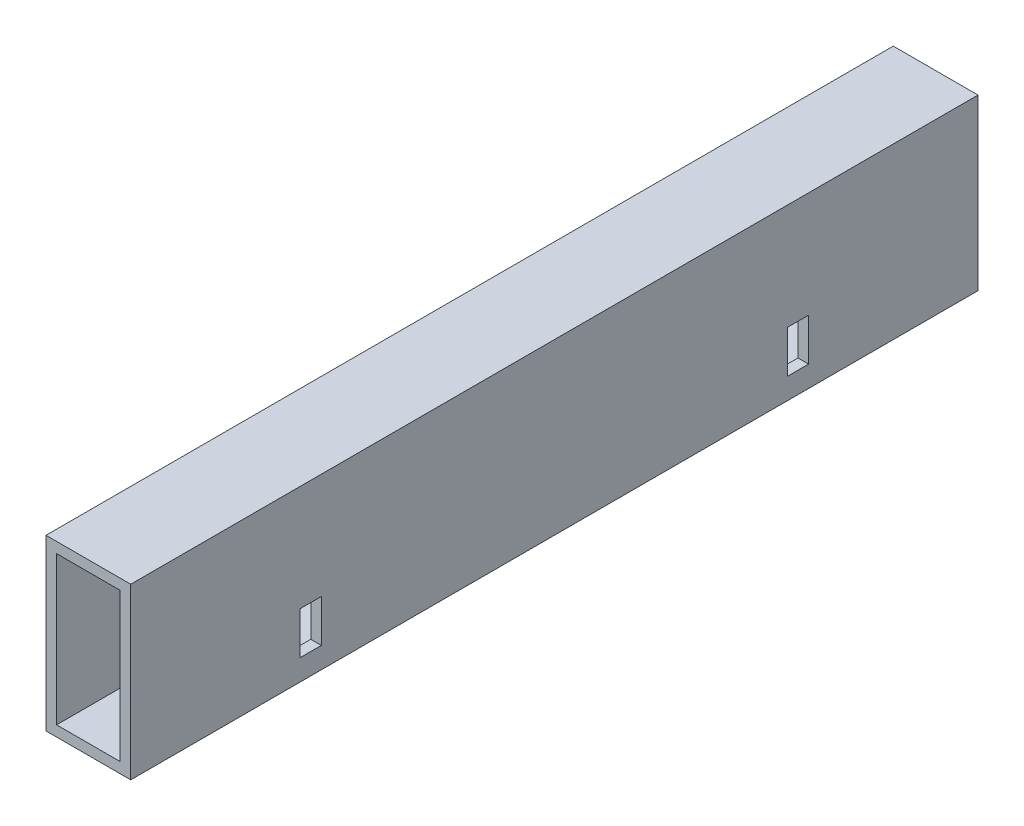
ISO-10303-21;
HEADER;
FILE_DESCRIPTION(('STEP AP214'),'2;1');
FILE_NAME('part.step','',(''),(''),'','','');
FILE_SCHEMA(('AUTOMOTIVE_DESIGN { 1 0 10303 214 1 1 1 1 }'));
ENDSEC;
DATA;
#1=APPLICATION_CONTEXT('core data for automotive mechanical design processes');
#2=APPLICATION_PROTOCOL_DEFINITION('international standard','automotive_design',2000,#1);
#3=PRODUCT_CONTEXT('',#1,'mechanical');
#4=PRODUCT('Part','Part','',(#3));
#5=PRODUCT_RELATED_PRODUCT_CATEGORY('part','',(#4));
#6=PRODUCT_DEFINITION_FORMATION('','',#4);
#7=PRODUCT_DEFINITION_CONTEXT('part definition',#1,'design');
#8=PRODUCT_DEFINITION('design','',#6,#7);
#9=PRODUCT_DEFINITION_SHAPE('','',#8);
#10=(LENGTH_UNIT() NAMED_UNIT(*) SI_UNIT(.MILLI.,.METRE.));
#11=(NAMED_UNIT(*) PLANE_ANGLE_UNIT() SI_UNIT($,.RADIAN.));
#12=(NAMED_UNIT(*) SI_UNIT($,.STERADIAN.) SOLID_ANGLE_UNIT());
#13=UNCERTAINTY_MEASURE_WITH_UNIT(LENGTH_MEASURE(1.E-05),#10,'distance_accuracy_value','');
#14=(GEOMETRIC_REPRESENTATION_CONTEXT(3) GLOBAL_UNCERTAINTY_ASSIGNED_CONTEXT((#13)) GLOBAL_UNIT_ASSIGNED_CONTEXT((#10,
#11,#12)) REPRESENTATION_CONTEXT('',''));
#15=CARTESIAN_POINT('',(0.,0.,0.));
#16=DIRECTION('',(0.,0.,1.));
#17=DIRECTION('',(1.,0.,0.));
#18=AXIS2_PLACEMENT_3D('',#15,#16,#17);
#19=CARTESIAN_POINT('',(0.,0.,254.));
#20=DIRECTION('',(0.,0.,-1.));
#21=DIRECTION('',(-1.,0.,0.));
#22=AXIS2_PLACEMENT_3D('',#19,#20,#21);
#23=PLANE('',#22);
#24=DIRECTION('',(0.,-1.,0.));
#25=VECTOR('',#24,1.);
#26=CARTESIAN_POINT('',(0.,0.,254.));
#27=LINE('',#26,#25);
#28=CARTESIAN_POINT('',(0.,50.8,254.));
#29=VERTEX_POINT('',#28);
#30=CARTESIAN_POINT('',(0.,0.,254.));
#31=VERTEX_POINT('',#30);
#32=EDGE_CURVE('E327',#29,#31,#27,.T.);
#33=ORIENTED_EDGE('',*,*,#32,.T.);
#34=DIRECTION('',(1.,0.,0.));
#35=VECTOR('',#34,1.);
#36=CARTESIAN_POINT('',(0.,0.,254.));
#37=LINE('',#36,#35);
#38=CARTESIAN_POINT('',(25.4,0.,254.));
#39=VERTEX_POINT('',#38);
#40=EDGE_CURVE('E330',#31,#39,#37,.T.);
#41=ORIENTED_EDGE('',*,*,#40,.T.);
#42=DIRECTION('',(0.,1.,0.));
#43=VECTOR('',#42,1.);
#44=CARTESIAN_POINT('',(25.4,0.,254.));
#45=LINE('',#44,#43);
#46=CARTESIAN_POINT('',(25.4,50.8,254.));
#47=VERTEX_POINT('',#46);
#48=EDGE_CURVE('E333',#39,#47,#45,.T.);
#49=ORIENTED_EDGE('',*,*,#48,.T.);
#50=DIRECTION('',(-1.,0.,0.));
#51=VECTOR('',#50,1.);
#52=CARTESIAN_POINT('',(0.,50.8,254.));
#53=LINE('',#52,#51);
#54=EDGE_CURVE('E335',#47,#29,#53,.T.);
#55=ORIENTED_EDGE('',*,*,#54,.T.);
#56=EDGE_LOOP('',(#33,#41,#49,#55));
#57=FACE_BOUND('',#56,.T.);
#58=DIRECTION('',(1.,0.,0.));
#59=VECTOR('',#58,1.);
#60=CARTESIAN_POINT('',(3.175,3.175,254.));
#61=LINE('',#60,#59);
#62=CARTESIAN_POINT('',(3.175,3.175,254.));
#63=VERTEX_POINT('',#62);
#64=CARTESIAN_POINT('',(22.225,3.175,254.));
#65=VERTEX_POINT('',#64);
#66=EDGE_CURVE('E296',#63,#65,#61,.T.);
#67=ORIENTED_EDGE('',*,*,#66,.F.);
#68=DIRECTION('',(0.,-1.,0.));
#69=VECTOR('',#68,1.);
#70=CARTESIAN_POINT('',(3.175,3.175,254.));
#71=LINE('',#70,#69);
#72=CARTESIAN_POINT('',(3.175,47.625,254.));
#73=VERTEX_POINT('',#72);
#74=EDGE_CURVE('E304',#73,#63,#71,.T.);
#75=ORIENTED_EDGE('',*,*,#74,.F.);
#76=DIRECTION('',(-1.,0.,0.));
#77=VECTOR('',#76,1.);
#78=CARTESIAN_POINT('',(3.175,47.625,254.));
#79=LINE('',#78,#77);
#80=CARTESIAN_POINT('',(22.225,47.625,254.));
#81=VERTEX_POINT('',#80);
#82=EDGE_CURVE('E301',#81,#73,#79,.T.);
#83=ORIENTED_EDGE('',*,*,#82,.F.);
#84=DIRECTION('',(0.,1.,0.));
#85=VECTOR('',#84,1.);
#86=CARTESIAN_POINT('',(22.225,3.175,254.));
#87=LINE('',#86,#85);
#88=EDGE_CURVE('E298',#65,#81,#87,.T.);
#89=ORIENTED_EDGE('',*,*,#88,.F.);
#90=EDGE_LOOP('',(#67,#75,#83,#89));
#91=FACE_BOUND('',#90,.T.);
#92=ADVANCED_FACE('F35',(#57,#91),#23,.F.);
#93=CARTESIAN_POINT('',(0.,0.,0.));
#94=DIRECTION('',(0.,0.,-1.));
#95=DIRECTION('',(-1.,0.,0.));
#96=AXIS2_PLACEMENT_3D('',#93,#94,#95);
#97=PLANE('',#96);
#98=DIRECTION('',(0.,-1.,0.));
#99=VECTOR('',#98,1.);
#100=CARTESIAN_POINT('',(0.,0.,0.));
#101=LINE('',#100,#99);
#102=CARTESIAN_POINT('',(0.,50.8,0.));
#103=VERTEX_POINT('',#102);
#104=CARTESIAN_POINT('',(0.,0.,0.));
#105=VERTEX_POINT('',#104);
#106=EDGE_CURVE('E326',#103,#105,#101,.T.);
#107=ORIENTED_EDGE('',*,*,#106,.F.);
#108=DIRECTION('',(-1.,0.,0.));
#109=VECTOR('',#108,1.);
#110=CARTESIAN_POINT('',(0.,50.8,0.));
#111=LINE('',#110,#109);
#112=CARTESIAN_POINT('',(25.4,50.8,0.));
#113=VERTEX_POINT('',#112);
#114=EDGE_CURVE('E331',#113,#103,#111,.T.);
#115=ORIENTED_EDGE('',*,*,#114,.F.);
#116=DIRECTION('',(0.,1.,0.));
#117=VECTOR('',#116,1.);
#118=CARTESIAN_POINT('',(25.4,0.,0.));
#119=LINE('',#118,#117);
#120=CARTESIAN_POINT('',(25.4,0.,0.));
#121=VERTEX_POINT('',#120);
#122=EDGE_CURVE('E342',#121,#113,#119,.T.);
#123=ORIENTED_EDGE('',*,*,#122,.F.);
#124=DIRECTION('',(1.,0.,0.));
#125=VECTOR('',#124,1.);
#126=CARTESIAN_POINT('',(0.,0.,0.));
#127=LINE('',#126,#125);
#128=EDGE_CURVE('E340',#105,#121,#127,.T.);
#129=ORIENTED_EDGE('',*,*,#128,.F.);
#130=EDGE_LOOP('',(#107,#115,#123,#129));
#131=FACE_BOUND('',#130,.T.);
#132=DIRECTION('',(0.,-1.,0.));
#133=VECTOR('',#132,1.);
#134=CARTESIAN_POINT('',(3.175,3.175,0.));
#135=LINE('',#134,#133);
#136=CARTESIAN_POINT('',(3.175,47.625,0.));
#137=VERTEX_POINT('',#136);
#138=CARTESIAN_POINT('',(3.175,3.175,0.));
#139=VERTEX_POINT('',#138);
#140=EDGE_CURVE('E299',#137,#139,#135,.T.);
#141=ORIENTED_EDGE('',*,*,#140,.T.);
#142=DIRECTION('',(1.,0.,0.));
#143=VECTOR('',#142,1.);
#144=CARTESIAN_POINT('',(3.175,3.175,0.));
#145=LINE('',#144,#143);
#146=CARTESIAN_POINT('',(22.225,3.175,0.));
#147=VERTEX_POINT('',#146);
#148=EDGE_CURVE('E295',#139,#147,#145,.T.);
#149=ORIENTED_EDGE('',*,*,#148,.T.);
#150=DIRECTION('',(0.,1.,0.));
#151=VECTOR('',#150,1.);
#152=CARTESIAN_POINT('',(22.225,3.175,0.));
#153=LINE('',#152,#151);
#154=CARTESIAN_POINT('',(22.225,47.625,0.));
#155=VERTEX_POINT('',#154);
#156=EDGE_CURVE('E309',#147,#155,#153,.T.);
#157=ORIENTED_EDGE('',*,*,#156,.T.);
#158=DIRECTION('',(-1.,0.,0.));
#159=VECTOR('',#158,1.);
#160=CARTESIAN_POINT('',(3.175,47.625,0.));
#161=LINE('',#160,#159);
#162=EDGE_CURVE('E312',#155,#137,#161,.T.);
#163=ORIENTED_EDGE('',*,*,#162,.T.);
#164=EDGE_LOOP('',(#141,#149,#157,#163));
#165=FACE_BOUND('',#164,.T.);
#166=ADVANCED_FACE('F389',(#131,#165),#97,.T.);
#167=CARTESIAN_POINT('',(0.,0.,254.));
#168=DIRECTION('',(1.,0.,0.));
#169=DIRECTION('',(0.,0.,-1.));
#170=AXIS2_PLACEMENT_3D('',#167,#168,#169);
#171=PLANE('',#170);
#172=DIRECTION('',(0.,0.,-1.));
#173=VECTOR('',#172,1.);
#174=CARTESIAN_POINT('',(0.,19.0500000000001,50.8000000000017));
#175=LINE('',#174,#173);
#176=CARTESIAN_POINT('',(0.,19.0500000000001,57.1500000000006));
#177=VERTEX_POINT('',#176);
#178=CARTESIAN_POINT('',(0.,19.0500000000001,50.8000000000017));
#179=VERTEX_POINT('',#178);
#180=EDGE_CURVE('E210',#177,#179,#175,.T.);
#181=ORIENTED_EDGE('',*,*,#180,.F.);
#182=DIRECTION('',(0.,1.,0.));
#183=VECTOR('',#182,1.);
#184=CARTESIAN_POINT('',(0.,19.0500000000001,57.1500000000006));
#185=LINE('',#184,#183);
#186=CARTESIAN_POINT('',(0.,6.32674840612091,57.1500000000006));
#187=VERTEX_POINT('',#186);
#188=EDGE_CURVE('E50',#187,#177,#185,.T.);
#189=ORIENTED_EDGE('',*,*,#188,.F.);
#190=DIRECTION('',(0.,-0.00366164378018717,0.999993296159943));
#191=VECTOR('',#190,1.);
#192=CARTESIAN_POINT('',(0.,6.32674840612091,57.1500000000006));
#193=LINE('',#192,#191);
#194=CARTESIAN_POINT('',(0.,6.35000000000006,50.8000000000017));
#195=VERTEX_POINT('',#194);
#196=EDGE_CURVE('E217',#195,#187,#193,.T.);
#197=ORIENTED_EDGE('',*,*,#196,.F.);
#198=DIRECTION('',(0.,-1.,0.));
#199=VECTOR('',#198,1.);
#200=CARTESIAN_POINT('',(0.,6.35000000000006,50.8000000000017));
#201=LINE('',#200,#199);
#202=EDGE_CURVE('E201',#179,#195,#201,.T.);
#203=ORIENTED_EDGE('',*,*,#202,.F.);
#204=EDGE_LOOP('',(#181,#189,#197,#203));
#205=FACE_BOUND('',#204,.T.);
#206=DIRECTION('',(0.,-1.,0.));
#207=VECTOR('',#206,1.);
#208=CARTESIAN_POINT('',(0.,19.0500000000001,196.849999999999));
#209=LINE('',#208,#207);
#210=CARTESIAN_POINT('',(0.,19.0500000000001,196.849999999999));
#211=VERTEX_POINT('',#210);
#212=CARTESIAN_POINT('',(0.,6.32674840612091,196.849999999999));
#213=VERTEX_POINT('',#212);
#214=EDGE_CURVE('E252',#211,#213,#209,.T.);
#215=ORIENTED_EDGE('',*,*,#214,.F.);
#216=DIRECTION('',(0.,0.,-1.));
#217=VECTOR('',#216,1.);
#218=CARTESIAN_POINT('',(0.,19.0500000000001,203.199999999998));
#219=LINE('',#218,#217);
#220=CARTESIAN_POINT('',(0.,19.0500000000001,203.199999999998));
#221=VERTEX_POINT('',#220);
#222=EDGE_CURVE('E250',#221,#211,#219,.T.);
#223=ORIENTED_EDGE('',*,*,#222,.F.);
#224=DIRECTION('',(0.,1.,0.));
#225=VECTOR('',#224,1.);
#226=CARTESIAN_POINT('',(0.,6.35000000000008,203.199999999998));
#227=LINE('',#226,#225);
#228=CARTESIAN_POINT('',(0.,6.35000000000008,203.199999999998));
#229=VERTEX_POINT('',#228);
#230=EDGE_CURVE('E258',#229,#221,#227,.T.);
#231=ORIENTED_EDGE('',*,*,#230,.F.);
#232=DIRECTION('',(0.,0.00366164378019018,0.999993296159943));
#233=VECTOR('',#232,1.);
#234=CARTESIAN_POINT('',(0.,6.32674840612091,196.849999999999));
#235=LINE('',#234,#233);
#236=EDGE_CURVE('E255',#213,#229,#235,.T.);
#237=ORIENTED_EDGE('',*,*,#236,.F.);
#238=EDGE_LOOP('',(#215,#223,#231,#237));
#239=FACE_BOUND('',#238,.T.);
#240=ORIENTED_EDGE('',*,*,#106,.T.);
#241=DIRECTION('',(0.,0.,-1.));
#242=VECTOR('',#241,1.);
#243=CARTESIAN_POINT('',(0.,0.,254.));
#244=LINE('',#243,#242);
#245=EDGE_CURVE('E353',#31,#105,#244,.T.);
#246=ORIENTED_EDGE('',*,*,#245,.F.);
#247=ORIENTED_EDGE('',*,*,#32,.F.);
#248=DIRECTION('',(0.,0.,-1.));
#249=VECTOR('',#248,1.);
#250=CARTESIAN_POINT('',(0.,50.8,254.));
#251=LINE('',#250,#249);
#252=EDGE_CURVE('E337',#29,#103,#251,.T.);
#253=ORIENTED_EDGE('',*,*,#252,.T.);
#254=EDGE_LOOP('',(#240,#246,#247,#253));
#255=FACE_BOUND('',#254,.T.);
#256=ADVANCED_FACE('F37',(#205,#239,#255),#171,.F.);
#257=CARTESIAN_POINT('',(0.,0.,254.));
#258=DIRECTION('',(0.,1.,0.));
#259=DIRECTION('',(0.,0.,1.));
#260=AXIS2_PLACEMENT_3D('',#257,#258,#259);
#261=PLANE('',#260);
#262=ORIENTED_EDGE('',*,*,#128,.T.);
#263=DIRECTION('',(0.,0.,-1.));
#264=VECTOR('',#263,1.);
#265=CARTESIAN_POINT('',(25.4,0.,254.));
#266=LINE('',#265,#264);
#267=EDGE_CURVE('E350',#39,#121,#266,.T.);
#268=ORIENTED_EDGE('',*,*,#267,.F.);
#269=ORIENTED_EDGE('',*,*,#40,.F.);
#270=ORIENTED_EDGE('',*,*,#245,.T.);
#271=EDGE_LOOP('',(#262,#268,#269,#270));
#272=FACE_BOUND('',#271,.T.);
#273=ADVANCED_FACE('F408',(#272),#261,.F.);
#274=CARTESIAN_POINT('',(25.4,0.,254.));
#275=DIRECTION('',(-1.,0.,0.));
#276=DIRECTION('',(0.,0.,1.));
#277=AXIS2_PLACEMENT_3D('',#274,#275,#276);
#278=PLANE('',#277);
#279=DIRECTION('',(0.,-0.00366164378018717,0.999993296159943));
#280=VECTOR('',#279,1.);
#281=CARTESIAN_POINT('',(25.4,5.60587383334817,254.020526850663));
#282=LINE('',#281,#280);
#283=CARTESIAN_POINT('',(25.4,6.35000000000006,50.8000000000017));
#284=VERTEX_POINT('',#283);
#285=CARTESIAN_POINT('',(25.4,6.32674840612091,57.1500000000006));
#286=VERTEX_POINT('',#285);
#287=EDGE_CURVE('E241',#284,#286,#282,.T.);
#288=ORIENTED_EDGE('',*,*,#287,.T.);
#289=DIRECTION('',(0.,1.,0.));
#290=VECTOR('',#289,1.);
#291=CARTESIAN_POINT('',(25.4,0.,57.1500000000006));
#292=LINE('',#291,#290);
#293=CARTESIAN_POINT('',(25.4,19.0500000000001,57.1500000000006));
#294=VERTEX_POINT('',#293);
#295=EDGE_CURVE('E247',#286,#294,#292,.T.);
#296=ORIENTED_EDGE('',*,*,#295,.T.);
#297=DIRECTION('',(0.,0.,-1.));
#298=VECTOR('',#297,1.);
#299=CARTESIAN_POINT('',(25.4,19.0500000000001,254.));
#300=LINE('',#299,#298);
#301=CARTESIAN_POINT('',(25.4,19.0500000000001,50.8000000000017));
#302=VERTEX_POINT('',#301);
#303=EDGE_CURVE('E231',#294,#302,#300,.T.);
#304=ORIENTED_EDGE('',*,*,#303,.T.);
#305=DIRECTION('',(0.,-1.,0.));
#306=VECTOR('',#305,1.);
#307=CARTESIAN_POINT('',(25.4,0.,50.8000000000017));
#308=LINE('',#307,#306);
#309=EDGE_CURVE('E236',#302,#284,#308,.T.);
#310=ORIENTED_EDGE('',*,*,#309,.T.);
#311=EDGE_LOOP('',(#288,#296,#304,#310));
#312=FACE_BOUND('',#311,.T.);
#313=DIRECTION('',(0.,1.,0.));
#314=VECTOR('',#313,1.);
#315=CARTESIAN_POINT('',(25.4,0.,203.199999999998));
#316=LINE('',#315,#314);
#317=CARTESIAN_POINT('',(25.4,6.35000000000008,203.199999999998));
#318=VERTEX_POINT('',#317);
#319=CARTESIAN_POINT('',(25.4,19.0500000000001,203.199999999998));
#320=VERTEX_POINT('',#319);
#321=EDGE_CURVE('E286',#318,#320,#316,.T.);
#322=ORIENTED_EDGE('',*,*,#321,.T.);
#323=DIRECTION('',(0.,0.,-1.));
#324=VECTOR('',#323,1.);
#325=CARTESIAN_POINT('',(25.4,19.0500000000002,254.));
#326=LINE('',#325,#324);
#327=CARTESIAN_POINT('',(25.4,19.0500000000001,196.849999999999));
#328=VERTEX_POINT('',#327);
#329=EDGE_CURVE('E292',#320,#328,#326,.T.);
#330=ORIENTED_EDGE('',*,*,#329,.T.);
#331=DIRECTION('',(0.,-1.,0.));
#332=VECTOR('',#331,1.);
#333=CARTESIAN_POINT('',(25.4,0.,196.849999999999));
#334=LINE('',#333,#332);
#335=CARTESIAN_POINT('',(25.4,6.32674840612091,196.849999999999));
#336=VERTEX_POINT('',#335);
#337=EDGE_CURVE('E276',#328,#336,#334,.T.);
#338=ORIENTED_EDGE('',*,*,#337,.T.);
#339=DIRECTION('',(0.,0.00366164378019018,0.999993296159943));
#340=VECTOR('',#339,1.);
#341=CARTESIAN_POINT('',(25.4,6.53592511855902,253.976067610003));
#342=LINE('',#341,#340);
#343=EDGE_CURVE('E281',#336,#318,#342,.T.);
#344=ORIENTED_EDGE('',*,*,#343,.T.);
#345=EDGE_LOOP('',(#322,#330,#338,#344));
#346=FACE_BOUND('',#345,.T.);
#347=ORIENTED_EDGE('',*,*,#122,.T.);
#348=DIRECTION('',(0.,0.,-1.));
#349=VECTOR('',#348,1.);
#350=CARTESIAN_POINT('',(25.4,50.8,254.));
#351=LINE('',#350,#349);
#352=EDGE_CURVE('E347',#47,#113,#351,.T.);
#353=ORIENTED_EDGE('',*,*,#352,.F.);
#354=ORIENTED_EDGE('',*,*,#48,.F.);
#355=ORIENTED_EDGE('',*,*,#267,.T.);
#356=EDGE_LOOP('',(#347,#353,#354,#355));
#357=FACE_BOUND('',#356,.T.);
#358=ADVANCED_FACE('F405',(#312,#346,#357),#278,.F.);
#359=CARTESIAN_POINT('',(0.,50.8,254.));
#360=DIRECTION('',(0.,-1.,0.));
#361=DIRECTION('',(0.,0.,-1.));
#362=AXIS2_PLACEMENT_3D('',#359,#360,#361);
#363=PLANE('',#362);
#364=ORIENTED_EDGE('',*,*,#114,.T.);
#365=ORIENTED_EDGE('',*,*,#252,.F.);
#366=ORIENTED_EDGE('',*,*,#54,.F.);
#367=ORIENTED_EDGE('',*,*,#352,.T.);
#368=EDGE_LOOP('',(#364,#365,#366,#367));
#369=FACE_BOUND('',#368,.T.);
#370=ADVANCED_FACE('F402',(#369),#363,.F.);
#371=CARTESIAN_POINT('',(3.175,3.175,254.));
#372=DIRECTION('',(0.,1.,0.));
#373=DIRECTION('',(0.,0.,1.));
#374=AXIS2_PLACEMENT_3D('',#371,#372,#373);
#375=PLANE('',#374);
#376=ORIENTED_EDGE('',*,*,#148,.F.);
#377=DIRECTION('',(0.,0.,-1.));
#378=VECTOR('',#377,1.);
#379=CARTESIAN_POINT('',(3.175,3.175,254.));
#380=LINE('',#379,#378);
#381=EDGE_CURVE('E306',#63,#139,#380,.T.);
#382=ORIENTED_EDGE('',*,*,#381,.F.);
#383=ORIENTED_EDGE('',*,*,#66,.T.);
#384=DIRECTION('',(0.,0.,-1.));
#385=VECTOR('',#384,1.);
#386=CARTESIAN_POINT('',(22.225,3.175,254.));
#387=LINE('',#386,#385);
#388=EDGE_CURVE('E323',#65,#147,#387,.T.);
#389=ORIENTED_EDGE('',*,*,#388,.T.);
#390=EDGE_LOOP('',(#376,#382,#383,#389));
#391=FACE_BOUND('',#390,.T.);
#392=ADVANCED_FACE('F399',(#391),#375,.T.);
#393=CARTESIAN_POINT('',(22.225,3.175,254.));
#394=DIRECTION('',(-1.,0.,0.));
#395=DIRECTION('',(0.,0.,1.));
#396=AXIS2_PLACEMENT_3D('',#393,#394,#395);
#397=PLANE('',#396);
#398=DIRECTION('',(0.,1.,0.));
#399=VECTOR('',#398,1.);
#400=CARTESIAN_POINT('',(22.225,3.175,57.1500000000006));
#401=LINE('',#400,#399);
#402=CARTESIAN_POINT('',(22.225,6.32674840612091,57.1500000000006));
#403=VERTEX_POINT('',#402);
#404=CARTESIAN_POINT('',(22.225,19.0500000000001,57.1500000000006));
#405=VERTEX_POINT('',#404);
#406=EDGE_CURVE('E244',#403,#405,#401,.T.);
#407=ORIENTED_EDGE('',*,*,#406,.F.);
#408=DIRECTION('',(0.,-0.00366164378018717,0.999993296159943));
#409=VECTOR('',#408,1.);
#410=CARTESIAN_POINT('',(22.225,5.60591640258985,254.008901209598));
#411=LINE('',#410,#409);
#412=CARTESIAN_POINT('',(22.225,6.35000000000006,50.8000000000017));
#413=VERTEX_POINT('',#412);
#414=EDGE_CURVE('E239',#413,#403,#411,.T.);
#415=ORIENTED_EDGE('',*,*,#414,.F.);
#416=DIRECTION('',(0.,-1.,0.));
#417=VECTOR('',#416,1.);
#418=CARTESIAN_POINT('',(22.225,3.175,50.8000000000017));
#419=LINE('',#418,#417);
#420=CARTESIAN_POINT('',(22.225,19.0500000000001,50.8000000000017));
#421=VERTEX_POINT('',#420);
#422=EDGE_CURVE('E234',#421,#413,#419,.T.);
#423=ORIENTED_EDGE('',*,*,#422,.F.);
#424=DIRECTION('',(0.,0.,-1.));
#425=VECTOR('',#424,1.);
#426=CARTESIAN_POINT('',(22.225,19.0500000000001,254.));
#427=LINE('',#426,#425);
#428=EDGE_CURVE('E229',#405,#421,#427,.T.);
#429=ORIENTED_EDGE('',*,*,#428,.F.);
#430=EDGE_LOOP('',(#407,#415,#423,#429));
#431=FACE_BOUND('',#430,.T.);
#432=DIRECTION('',(0.,0.,-1.));
#433=VECTOR('',#432,1.);
#434=CARTESIAN_POINT('',(22.225,19.0500000000002,254.));
#435=LINE('',#434,#433);
#436=CARTESIAN_POINT('',(22.225,19.0500000000001,203.199999999998));
#437=VERTEX_POINT('',#436);
#438=CARTESIAN_POINT('',(22.225,19.0500000000001,196.849999999999));
#439=VERTEX_POINT('',#438);
#440=EDGE_CURVE('E289',#437,#439,#435,.T.);
#441=ORIENTED_EDGE('',*,*,#440,.F.);
#442=DIRECTION('',(0.,1.,0.));
#443=VECTOR('',#442,1.);
#444=CARTESIAN_POINT('',(22.225,3.175,203.199999999998));
#445=LINE('',#444,#443);
#446=CARTESIAN_POINT('',(22.225,6.35000000000008,203.199999999998));
#447=VERTEX_POINT('',#446);
#448=EDGE_CURVE('E284',#447,#437,#445,.T.);
#449=ORIENTED_EDGE('',*,*,#448,.F.);
#450=DIRECTION('',(0.,0.00366164378019018,0.999993296159943));
#451=VECTOR('',#450,1.);
#452=CARTESIAN_POINT('',(22.225,6.5359676878007,253.987693251068));
#453=LINE('',#452,#451);
#454=CARTESIAN_POINT('',(22.225,6.32674840612091,196.849999999999));
#455=VERTEX_POINT('',#454);
#456=EDGE_CURVE('E279',#455,#447,#453,.T.);
#457=ORIENTED_EDGE('',*,*,#456,.F.);
#458=DIRECTION('',(0.,-1.,0.));
#459=VECTOR('',#458,1.);
#460=CARTESIAN_POINT('',(22.225,3.175,196.849999999999));
#461=LINE('',#460,#459);
#462=EDGE_CURVE('E274',#439,#455,#461,.T.);
#463=ORIENTED_EDGE('',*,*,#462,.F.);
#464=EDGE_LOOP('',(#441,#449,#457,#463));
#465=FACE_BOUND('',#464,.T.);
#466=ORIENTED_EDGE('',*,*,#156,.F.);
#467=ORIENTED_EDGE('',*,*,#388,.F.);
#468=ORIENTED_EDGE('',*,*,#88,.T.);
#469=DIRECTION('',(0.,0.,-1.));
#470=VECTOR('',#469,1.);
#471=CARTESIAN_POINT('',(22.225,47.625,254.));
#472=LINE('',#471,#470);
#473=EDGE_CURVE('E321',#81,#155,#472,.T.);
#474=ORIENTED_EDGE('',*,*,#473,.T.);
#475=EDGE_LOOP('',(#466,#467,#468,#474));
#476=FACE_BOUND('',#475,.T.);
#477=ADVANCED_FACE('F440',(#431,#465,#476),#397,.T.);
#478=CARTESIAN_POINT('',(3.175,47.625,254.));
#479=DIRECTION('',(0.,-1.,0.));
#480=DIRECTION('',(0.,0.,-1.));
#481=AXIS2_PLACEMENT_3D('',#478,#479,#480);
#482=PLANE('',#481);
#483=ORIENTED_EDGE('',*,*,#162,.F.);
#484=ORIENTED_EDGE('',*,*,#473,.F.);
#485=ORIENTED_EDGE('',*,*,#82,.T.);
#486=DIRECTION('',(0.,0.,-1.));
#487=VECTOR('',#486,1.);
#488=CARTESIAN_POINT('',(3.175,47.625,254.));
#489=LINE('',#488,#487);
#490=EDGE_CURVE('E319',#73,#137,#489,.T.);
#491=ORIENTED_EDGE('',*,*,#490,.T.);
#492=EDGE_LOOP('',(#483,#484,#485,#491));
#493=FACE_BOUND('',#492,.T.);
#494=ADVANCED_FACE('F442',(#493),#482,.T.);
#495=CARTESIAN_POINT('',(3.175,3.175,254.));
#496=DIRECTION('',(1.,0.,0.));
#497=DIRECTION('',(0.,0.,-1.));
#498=AXIS2_PLACEMENT_3D('',#495,#496,#497);
#499=PLANE('',#498);
#500=DIRECTION('',(0.,-1.,0.));
#501=VECTOR('',#500,1.);
#502=CARTESIAN_POINT('',(3.175,3.175,57.1500000000006));
#503=LINE('',#502,#501);
#504=CARTESIAN_POINT('',(3.17499999999998,19.0500000000001,57.1500000000006));
#505=VERTEX_POINT('',#504);
#506=CARTESIAN_POINT('',(3.17499999999998,6.32674840612091,57.1500000000006));
#507=VERTEX_POINT('',#506);
#508=EDGE_CURVE('E11',#505,#507,#503,.T.);
#509=ORIENTED_EDGE('',*,*,#508,.F.);
#510=DIRECTION('',(0.,0.,1.));
#511=VECTOR('',#510,1.);
#512=CARTESIAN_POINT('',(3.175,19.0500000000001,254.));
#513=LINE('',#512,#511);
#514=CARTESIAN_POINT('',(3.175,19.0500000000001,50.8000000000017));
#515=VERTEX_POINT('',#514);
#516=EDGE_CURVE('E365',#515,#505,#513,.T.);
#517=ORIENTED_EDGE('',*,*,#516,.F.);
#518=DIRECTION('',(0.,1.,0.));
#519=VECTOR('',#518,1.);
#520=CARTESIAN_POINT('',(3.175,3.175,50.8000000000017));
#521=LINE('',#520,#519);
#522=CARTESIAN_POINT('',(3.17499999999998,6.35000000000006,50.8000000000017));
#523=VERTEX_POINT('',#522);
#524=EDGE_CURVE('E204',#523,#515,#521,.T.);
#525=ORIENTED_EDGE('',*,*,#524,.F.);
#526=DIRECTION('',(0.,0.00366164378018717,-0.999993296159943));
#527=VECTOR('',#526,1.);
#528=CARTESIAN_POINT('',(3.175,5.60591640258985,254.008901209598));
#529=LINE('',#528,#527);
#530=EDGE_CURVE('E43',#507,#523,#529,.T.);
#531=ORIENTED_EDGE('',*,*,#530,.F.);
#532=EDGE_LOOP('',(#509,#517,#525,#531));
#533=FACE_BOUND('',#532,.T.);
#534=DIRECTION('',(0.,0.,1.));
#535=VECTOR('',#534,1.);
#536=CARTESIAN_POINT('',(3.175,19.0500000000002,254.));
#537=LINE('',#536,#535);
#538=CARTESIAN_POINT('',(3.17499999999998,19.0500000000001,196.849999999999));
#539=VERTEX_POINT('',#538);
#540=CARTESIAN_POINT('',(3.17499999999998,19.0500000000001,203.199999999998));
#541=VERTEX_POINT('',#540);
#542=EDGE_CURVE('E363',#539,#541,#537,.T.);
#543=ORIENTED_EDGE('',*,*,#542,.F.);
#544=DIRECTION('',(0.,1.,0.));
#545=VECTOR('',#544,1.);
#546=CARTESIAN_POINT('',(3.175,3.175,196.849999999999));
#547=LINE('',#546,#545);
#548=CARTESIAN_POINT('',(3.175,6.32674840612091,196.849999999999));
#549=VERTEX_POINT('',#548);
#550=EDGE_CURVE('E356',#549,#539,#547,.T.);
#551=ORIENTED_EDGE('',*,*,#550,.F.);
#552=DIRECTION('',(0.,-0.00366164378019018,-0.999993296159943));
#553=VECTOR('',#552,1.);
#554=CARTESIAN_POINT('',(3.175,6.5359676878007,253.987693251068));
#555=LINE('',#554,#553);
#556=CARTESIAN_POINT('',(3.17499999999998,6.35000000000008,203.199999999998));
#557=VERTEX_POINT('',#556);
#558=EDGE_CURVE('E358',#557,#549,#555,.T.);
#559=ORIENTED_EDGE('',*,*,#558,.F.);
#560=DIRECTION('',(0.,-1.,0.));
#561=VECTOR('',#560,1.);
#562=CARTESIAN_POINT('',(3.175,3.175,203.199999999998));
#563=LINE('',#562,#561);
#564=EDGE_CURVE('E361',#541,#557,#563,.T.);
#565=ORIENTED_EDGE('',*,*,#564,.F.);
#566=EDGE_LOOP('',(#543,#551,#559,#565));
#567=FACE_BOUND('',#566,.T.);
#568=ORIENTED_EDGE('',*,*,#140,.F.);
#569=ORIENTED_EDGE('',*,*,#490,.F.);
#570=ORIENTED_EDGE('',*,*,#74,.T.);
#571=ORIENTED_EDGE('',*,*,#381,.T.);
#572=EDGE_LOOP('',(#568,#569,#570,#571));
#573=FACE_BOUND('',#572,.T.);
#574=ADVANCED_FACE('F373',(#533,#567,#573),#499,.T.);
#575=CARTESIAN_POINT('',(254.,19.0500000000001,196.849999999999));
#576=DIRECTION('',(0.,0.,-1.));
#577=DIRECTION('',(-1.,0.,0.));
#578=AXIS2_PLACEMENT_3D('',#575,#576,#577);
#579=PLANE('',#578);
#580=ORIENTED_EDGE('',*,*,#550,.T.);
#581=DIRECTION('',(-1.,0.,0.));
#582=VECTOR('',#581,1.);
#583=CARTESIAN_POINT('',(254.,19.0500000000001,196.849999999999));
#584=LINE('',#583,#582);
#585=EDGE_CURVE('E261',#539,#211,#584,.T.);
#586=ORIENTED_EDGE('',*,*,#585,.T.);
#587=ORIENTED_EDGE('',*,*,#214,.T.);
#588=DIRECTION('',(-1.,0.,0.));
#589=VECTOR('',#588,1.);
#590=CARTESIAN_POINT('',(254.,6.32674840612091,196.849999999999));
#591=LINE('',#590,#589);
#592=EDGE_CURVE('E269',#549,#213,#591,.T.);
#593=ORIENTED_EDGE('',*,*,#592,.F.);
#594=EDGE_LOOP('',(#580,#586,#587,#593));
#595=FACE_BOUND('',#594,.T.);
#596=ADVANCED_FACE('F449',(#595),#579,.F.);
#597=CARTESIAN_POINT('',(254.,6.32674840612091,196.849999999999));
#598=DIRECTION('',(0.,-0.999993296159943,0.00366164378019018));
#599=DIRECTION('',(0.,-0.00366164378019018,-0.999993296159943));
#600=AXIS2_PLACEMENT_3D('',#597,#598,#599);
#601=PLANE('',#600);
#602=ORIENTED_EDGE('',*,*,#558,.T.);
#603=ORIENTED_EDGE('',*,*,#592,.T.);
#604=ORIENTED_EDGE('',*,*,#236,.T.);
#605=DIRECTION('',(-1.,0.,0.));
#606=VECTOR('',#605,1.);
#607=CARTESIAN_POINT('',(254.,6.35000000000008,203.199999999998));
#608=LINE('',#607,#606);
#609=EDGE_CURVE('E266',#557,#229,#608,.T.);
#610=ORIENTED_EDGE('',*,*,#609,.F.);
#611=EDGE_LOOP('',(#602,#603,#604,#610));
#612=FACE_BOUND('',#611,.T.);
#613=ADVANCED_FACE('F462',(#612),#601,.F.);
#614=CARTESIAN_POINT('',(254.,6.35000000000008,203.199999999998));
#615=DIRECTION('',(0.,0.,1.));
#616=DIRECTION('',(1.,0.,0.));
#617=AXIS2_PLACEMENT_3D('',#614,#615,#616);
#618=PLANE('',#617);
#619=ORIENTED_EDGE('',*,*,#564,.T.);
#620=ORIENTED_EDGE('',*,*,#609,.T.);
#621=ORIENTED_EDGE('',*,*,#230,.T.);
#622=DIRECTION('',(-1.,0.,0.));
#623=VECTOR('',#622,1.);
#624=CARTESIAN_POINT('',(254.,19.0500000000001,203.199999999998));
#625=LINE('',#624,#623);
#626=EDGE_CURVE('E262',#541,#221,#625,.T.);
#627=ORIENTED_EDGE('',*,*,#626,.F.);
#628=EDGE_LOOP('',(#619,#620,#621,#627));
#629=FACE_BOUND('',#628,.T.);
#630=ADVANCED_FACE('F458',(#629),#618,.F.);
#631=CARTESIAN_POINT('',(254.,19.0500000000001,203.199999999998));
#632=DIRECTION('',(0.,1.,0.));
#633=DIRECTION('',(0.,0.,1.));
#634=AXIS2_PLACEMENT_3D('',#631,#632,#633);
#635=PLANE('',#634);
#636=ORIENTED_EDGE('',*,*,#542,.T.);
#637=ORIENTED_EDGE('',*,*,#626,.T.);
#638=ORIENTED_EDGE('',*,*,#222,.T.);
#639=ORIENTED_EDGE('',*,*,#585,.F.);
#640=EDGE_LOOP('',(#636,#637,#638,#639));
#641=FACE_BOUND('',#640,.T.);
#642=ADVANCED_FACE('F454',(#641),#635,.F.);
#643=EDGE_CURVE('E264',#320,#437,#625,.T.);
#644=ORIENTED_EDGE('',*,*,#643,.T.);
#645=ORIENTED_EDGE('',*,*,#440,.T.);
#646=EDGE_CURVE('E271',#328,#439,#584,.T.);
#647=ORIENTED_EDGE('',*,*,#646,.F.);
#648=ORIENTED_EDGE('',*,*,#329,.F.);
#649=EDGE_LOOP('',(#644,#645,#647,#648));
#650=FACE_BOUND('',#649,.T.);
#651=ADVANCED_FACE('F457',(#650),#635,.F.);
#652=EDGE_CURVE('E265',#318,#447,#608,.T.);
#653=ORIENTED_EDGE('',*,*,#652,.T.);
#654=ORIENTED_EDGE('',*,*,#448,.T.);
#655=ORIENTED_EDGE('',*,*,#643,.F.);
#656=ORIENTED_EDGE('',*,*,#321,.F.);
#657=EDGE_LOOP('',(#653,#654,#655,#656));
#658=FACE_BOUND('',#657,.T.);
#659=ADVANCED_FACE('F470',(#658),#618,.F.);
#660=EDGE_CURVE('E268',#336,#455,#591,.T.);
#661=ORIENTED_EDGE('',*,*,#660,.T.);
#662=ORIENTED_EDGE('',*,*,#456,.T.);
#663=ORIENTED_EDGE('',*,*,#652,.F.);
#664=ORIENTED_EDGE('',*,*,#343,.F.);
#665=EDGE_LOOP('',(#661,#662,#663,#664));
#666=FACE_BOUND('',#665,.T.);
#667=ADVANCED_FACE('F467',(#666),#601,.F.);
#668=ORIENTED_EDGE('',*,*,#646,.T.);
#669=ORIENTED_EDGE('',*,*,#462,.T.);
#670=ORIENTED_EDGE('',*,*,#660,.F.);
#671=ORIENTED_EDGE('',*,*,#337,.F.);
#672=EDGE_LOOP('',(#668,#669,#670,#671));
#673=FACE_BOUND('',#672,.T.);
#674=ADVANCED_FACE('F464',(#673),#579,.F.);
#675=CARTESIAN_POINT('',(254.,19.0500000000001,50.8000000000017));
#676=DIRECTION('',(0.,1.,0.));
#677=DIRECTION('',(0.,0.,1.));
#678=AXIS2_PLACEMENT_3D('',#675,#676,#677);
#679=PLANE('',#678);
#680=ORIENTED_EDGE('',*,*,#516,.T.);
#681=DIRECTION('',(-1.,0.,0.));
#682=VECTOR('',#681,1.);
#683=CARTESIAN_POINT('',(254.,19.0500000000001,57.1500000000006));
#684=LINE('',#683,#682);
#685=EDGE_CURVE('E212',#505,#177,#684,.T.);
#686=ORIENTED_EDGE('',*,*,#685,.T.);
#687=ORIENTED_EDGE('',*,*,#180,.T.);
#688=DIRECTION('',(-1.,0.,0.));
#689=VECTOR('',#688,1.);
#690=CARTESIAN_POINT('',(254.,19.0500000000001,50.8000000000017));
#691=LINE('',#690,#689);
#692=EDGE_CURVE('E196',#515,#179,#691,.T.);
#693=ORIENTED_EDGE('',*,*,#692,.F.);
#694=EDGE_LOOP('',(#680,#686,#687,#693));
#695=FACE_BOUND('',#694,.T.);
#696=ADVANCED_FACE('F211',(#695),#679,.F.);
#697=CARTESIAN_POINT('',(254.,6.35000000000006,50.8000000000017));
#698=DIRECTION('',(0.,0.,-1.));
#699=DIRECTION('',(-1.,0.,0.));
#700=AXIS2_PLACEMENT_3D('',#697,#698,#699);
#701=PLANE('',#700);
#702=ORIENTED_EDGE('',*,*,#524,.T.);
#703=ORIENTED_EDGE('',*,*,#692,.T.);
#704=ORIENTED_EDGE('',*,*,#202,.T.);
#705=DIRECTION('',(-1.,0.,0.));
#706=VECTOR('',#705,1.);
#707=CARTESIAN_POINT('',(254.,6.35000000000006,50.8000000000017));
#708=LINE('',#707,#706);
#709=EDGE_CURVE('E226',#523,#195,#708,.T.);
#710=ORIENTED_EDGE('',*,*,#709,.F.);
#711=EDGE_LOOP('',(#702,#703,#704,#710));
#712=FACE_BOUND('',#711,.T.);
#713=ADVANCED_FACE('F198',(#712),#701,.F.);
#714=CARTESIAN_POINT('',(254.,6.32674840612091,57.1500000000006));
#715=DIRECTION('',(0.,-0.999993296159943,-0.00366164378018717));
#716=DIRECTION('',(0.,0.00366164378018717,-0.999993296159943));
#717=AXIS2_PLACEMENT_3D('',#714,#715,#716);
#718=PLANE('',#717);
#719=ORIENTED_EDGE('',*,*,#530,.T.);
#720=ORIENTED_EDGE('',*,*,#709,.T.);
#721=ORIENTED_EDGE('',*,*,#196,.T.);
#722=DIRECTION('',(-1.,0.,0.));
#723=VECTOR('',#722,1.);
#724=CARTESIAN_POINT('',(254.,6.32674840612091,57.1500000000006));
#725=LINE('',#724,#723);
#726=EDGE_CURVE('E222',#507,#187,#725,.T.);
#727=ORIENTED_EDGE('',*,*,#726,.F.);
#728=EDGE_LOOP('',(#719,#720,#721,#727));
#729=FACE_BOUND('',#728,.T.);
#730=ADVANCED_FACE('F370',(#729),#718,.F.);
#731=CARTESIAN_POINT('',(254.,19.0500000000001,57.1500000000006));
#732=DIRECTION('',(0.,0.,1.));
#733=DIRECTION('',(1.,0.,0.));
#734=AXIS2_PLACEMENT_3D('',#731,#732,#733);
#735=PLANE('',#734);
#736=ORIENTED_EDGE('',*,*,#508,.T.);
#737=ORIENTED_EDGE('',*,*,#726,.T.);
#738=ORIENTED_EDGE('',*,*,#188,.T.);
#739=ORIENTED_EDGE('',*,*,#685,.F.);
#740=EDGE_LOOP('',(#736,#737,#738,#739));
#741=FACE_BOUND('',#740,.T.);
#742=ADVANCED_FACE('F375',(#741),#735,.F.);
#743=EDGE_CURVE('E224',#286,#403,#725,.T.);
#744=ORIENTED_EDGE('',*,*,#743,.T.);
#745=ORIENTED_EDGE('',*,*,#406,.T.);
#746=EDGE_CURVE('E207',#294,#405,#684,.T.);
#747=ORIENTED_EDGE('',*,*,#746,.F.);
#748=ORIENTED_EDGE('',*,*,#295,.F.);
#749=EDGE_LOOP('',(#744,#745,#747,#748));
#750=FACE_BOUND('',#749,.T.);
#751=ADVANCED_FACE('F377',(#750),#735,.F.);
#752=EDGE_CURVE('E225',#284,#413,#708,.T.);
#753=ORIENTED_EDGE('',*,*,#752,.T.);
#754=ORIENTED_EDGE('',*,*,#414,.T.);
#755=ORIENTED_EDGE('',*,*,#743,.F.);
#756=ORIENTED_EDGE('',*,*,#287,.F.);
#757=EDGE_LOOP('',(#753,#754,#755,#756));
#758=FACE_BOUND('',#757,.T.);
#759=ADVANCED_FACE('F383',(#758),#718,.F.);
#760=EDGE_CURVE('E58',#302,#421,#691,.T.);
#761=ORIENTED_EDGE('',*,*,#760,.T.);
#762=ORIENTED_EDGE('',*,*,#422,.T.);
#763=ORIENTED_EDGE('',*,*,#752,.F.);
#764=ORIENTED_EDGE('',*,*,#309,.F.);
#765=EDGE_LOOP('',(#761,#762,#763,#764));
#766=FACE_BOUND('',#765,.T.);
#767=ADVANCED_FACE('F504',(#766),#701,.F.);
#768=ORIENTED_EDGE('',*,*,#746,.T.);
#769=ORIENTED_EDGE('',*,*,#428,.T.);
#770=ORIENTED_EDGE('',*,*,#760,.F.);
#771=ORIENTED_EDGE('',*,*,#303,.F.);
#772=EDGE_LOOP('',(#768,#769,#770,#771));
#773=FACE_BOUND('',#772,.T.);
#774=ADVANCED_FACE('F499',(#773),#679,.F.);
#775=CLOSED_SHELL('',(#92,#166,#256,#273,#358,#370,#392,#477,#494,#574,#596,#613,#630,#642,#651,
#659,#667,#674,#696,#713,#730,#742,#751,#759,#767,#774));
#776=MANIFOLD_SOLID_BREP('B2',#775);
#777=ADVANCED_BREP_SHAPE_REPRESENTATION('',(#18,#776),#14);
#778=SHAPE_DEFINITION_REPRESENTATION(#9,#777);
ENDSEC;
END-ISO-10303-21;
